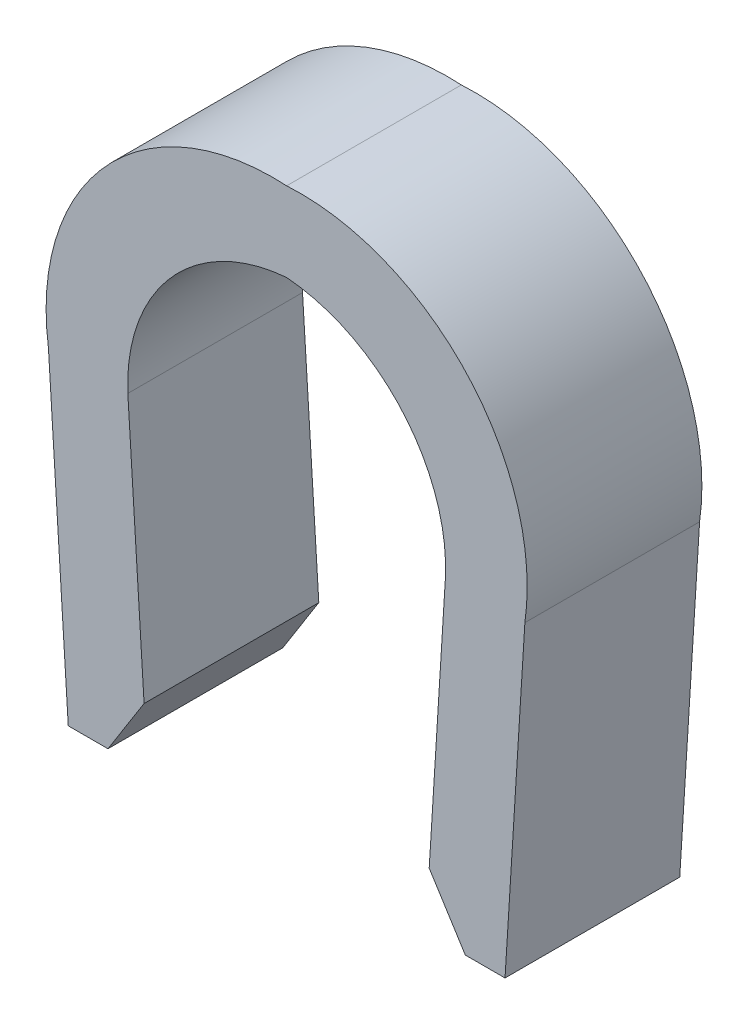
ISO-10303-21;
HEADER;
FILE_DESCRIPTION(('STEP AP214'),'2;1');
FILE_NAME('part.step','',(''),(''),'','','');
FILE_SCHEMA(('AUTOMOTIVE_DESIGN { 1 0 10303 214 1 1 1 1 }'));
ENDSEC;
DATA;
#1=APPLICATION_CONTEXT('core data for automotive mechanical design processes');
#2=APPLICATION_PROTOCOL_DEFINITION('international standard','automotive_design',2000,#1);
#3=PRODUCT_CONTEXT('',#1,'mechanical');
#4=PRODUCT('Part','Part','',(#3));
#5=PRODUCT_RELATED_PRODUCT_CATEGORY('part','',(#4));
#6=PRODUCT_DEFINITION_FORMATION('','',#4);
#7=PRODUCT_DEFINITION_CONTEXT('part definition',#1,'design');
#8=PRODUCT_DEFINITION('design','',#6,#7);
#9=PRODUCT_DEFINITION_SHAPE('','',#8);
#10=(LENGTH_UNIT() NAMED_UNIT(*) SI_UNIT(.MILLI.,.METRE.));
#11=(NAMED_UNIT(*) PLANE_ANGLE_UNIT() SI_UNIT($,.RADIAN.));
#12=(NAMED_UNIT(*) SI_UNIT($,.STERADIAN.) SOLID_ANGLE_UNIT());
#13=UNCERTAINTY_MEASURE_WITH_UNIT(LENGTH_MEASURE(1.E-05),#10,'distance_accuracy_value','');
#14=(GEOMETRIC_REPRESENTATION_CONTEXT(3) GLOBAL_UNCERTAINTY_ASSIGNED_CONTEXT((#13)) GLOBAL_UNIT_ASSIGNED_CONTEXT((#10,
#11,#12)) REPRESENTATION_CONTEXT('',''));
#15=CARTESIAN_POINT('',(0.,0.,0.));
#16=DIRECTION('',(0.,0.,1.));
#17=DIRECTION('',(1.,0.,0.));
#18=AXIS2_PLACEMENT_3D('',#15,#16,#17);
#19=CARTESIAN_POINT('',(4.,3.76931874325355,4.4));
#20=DIRECTION('',(0.998052578482889,-0.0623782861551805,0.));
#21=DIRECTION('',(0.0623782861551805,0.998052578482889,0.));
#22=AXIS2_PLACEMENT_3D('',#19,#20,#21);
#23=PLANE('',#22);
#24=DIRECTION('',(0.,0.,-1.));
#25=VECTOR('',#24,1.);
#26=CARTESIAN_POINT('',(3.59009666619429,-2.78913459763788,4.4));
#27=LINE('',#26,#25);
#28=CARTESIAN_POINT('',(3.59009666619429,-2.78913459763788,4.4));
#29=VERTEX_POINT('',#28);
#30=CARTESIAN_POINT('',(3.59009666619429,-2.78913459763788,0.));
#31=VERTEX_POINT('',#30);
#32=EDGE_CURVE('E48',#29,#31,#27,.T.);
#33=ORIENTED_EDGE('',*,*,#32,.F.);
#34=DIRECTION('',(-0.0623782861551805,-0.998052578482889,0.));
#35=VECTOR('',#34,1.);
#36=CARTESIAN_POINT('',(4.,3.76931874325355,4.4));
#37=LINE('',#36,#35);
#38=CARTESIAN_POINT('',(4.,3.76931874325355,4.4));
#39=VERTEX_POINT('',#38);
#40=EDGE_CURVE('E201',#39,#29,#37,.T.);
#41=ORIENTED_EDGE('',*,*,#40,.F.);
#42=DIRECTION('',(0.,0.,-1.));
#43=VECTOR('',#42,1.);
#44=CARTESIAN_POINT('',(4.,3.76931874325355,4.4));
#45=LINE('',#44,#43);
#46=CARTESIAN_POINT('',(4.,3.76931874325355,0.));
#47=VERTEX_POINT('',#46);
#48=EDGE_CURVE('E186',#39,#47,#45,.T.);
#49=ORIENTED_EDGE('',*,*,#48,.T.);
#50=DIRECTION('',(-0.0623782861551805,-0.998052578482889,0.));
#51=VECTOR('',#50,1.);
#52=CARTESIAN_POINT('',(4.,3.76931874325355,0.));
#53=LINE('',#52,#51);
#54=EDGE_CURVE('E153',#47,#31,#53,.T.);
#55=ORIENTED_EDGE('',*,*,#54,.T.);
#56=EDGE_LOOP('',(#33,#41,#49,#55));
#57=FACE_BOUND('',#56,.T.);
#58=ADVANCED_FACE('F33',(#57),#23,.F.);
#59=CARTESIAN_POINT('',(3.5,-4.23068125674645,4.4));
#60=DIRECTION('',(0.,1.,0.));
#61=DIRECTION('',(0.,0.,1.));
#62=AXIS2_PLACEMENT_3D('',#59,#60,#61);
#63=PLANE('',#62);
#64=DIRECTION('',(0.,0.,-1.));
#65=VECTOR('',#64,1.);
#66=CARTESIAN_POINT('',(4.5,-4.23068125674645,4.4));
#67=LINE('',#66,#65);
#68=CARTESIAN_POINT('',(4.5,-4.23068125674645,4.4));
#69=VERTEX_POINT('',#68);
#70=CARTESIAN_POINT('',(4.5,-4.23068125674645,0.));
#71=VERTEX_POINT('',#70);
#72=EDGE_CURVE('E136',#69,#71,#67,.T.);
#73=ORIENTED_EDGE('',*,*,#72,.T.);
#74=DIRECTION('',(1.,0.,0.));
#75=VECTOR('',#74,1.);
#76=CARTESIAN_POINT('',(3.5,-4.23068125674645,0.));
#77=LINE('',#76,#75);
#78=CARTESIAN_POINT('',(5.5,-4.23068125674645,0.));
#79=VERTEX_POINT('',#78);
#80=EDGE_CURVE('E156',#71,#79,#77,.T.);
#81=ORIENTED_EDGE('',*,*,#80,.T.);
#82=DIRECTION('',(0.,0.,-1.));
#83=VECTOR('',#82,1.);
#84=CARTESIAN_POINT('',(5.5,-4.23068125674645,4.4));
#85=LINE('',#84,#83);
#86=CARTESIAN_POINT('',(5.5,-4.23068125674645,4.4));
#87=VERTEX_POINT('',#86);
#88=EDGE_CURVE('E183',#87,#79,#85,.T.);
#89=ORIENTED_EDGE('',*,*,#88,.F.);
#90=DIRECTION('',(1.,0.,0.));
#91=VECTOR('',#90,1.);
#92=CARTESIAN_POINT('',(3.5,-4.23068125674645,4.4));
#93=LINE('',#92,#91);
#94=EDGE_CURVE('E214',#69,#87,#93,.T.);
#95=ORIENTED_EDGE('',*,*,#94,.F.);
#96=EDGE_LOOP('',(#73,#81,#89,#95));
#97=FACE_BOUND('',#96,.T.);
#98=ADVANCED_FACE('F236',(#97),#63,.F.);
#99=CARTESIAN_POINT('',(-3.5,-4.23068125674645,4.4));
#100=DIRECTION('',(0.,1.,0.));
#101=DIRECTION('',(0.,0.,1.));
#102=AXIS2_PLACEMENT_3D('',#99,#100,#101);
#103=PLANE('',#102);
#104=DIRECTION('',(0.,0.,-1.));
#105=VECTOR('',#104,1.);
#106=CARTESIAN_POINT('',(-4.5,-4.23068125674645,4.4));
#107=LINE('',#106,#105);
#108=CARTESIAN_POINT('',(-4.5,-4.23068125674645,4.4));
#109=VERTEX_POINT('',#108);
#110=CARTESIAN_POINT('',(-4.5,-4.23068125674645,0.));
#111=VERTEX_POINT('',#110);
#112=EDGE_CURVE('E56',#109,#111,#107,.T.);
#113=ORIENTED_EDGE('',*,*,#112,.F.);
#114=DIRECTION('',(1.,0.,0.));
#115=VECTOR('',#114,1.);
#116=CARTESIAN_POINT('',(-3.5,-4.23068125674645,4.4));
#117=LINE('',#116,#115);
#118=CARTESIAN_POINT('',(-5.5,-4.23068125674645,4.4));
#119=VERTEX_POINT('',#118);
#120=EDGE_CURVE('E135',#119,#109,#117,.T.);
#121=ORIENTED_EDGE('',*,*,#120,.F.);
#122=DIRECTION('',(0.,0.,-1.));
#123=VECTOR('',#122,1.);
#124=CARTESIAN_POINT('',(-5.5,-4.23068125674645,4.4));
#125=LINE('',#124,#123);
#126=CARTESIAN_POINT('',(-5.5,-4.23068125674645,0.));
#127=VERTEX_POINT('',#126);
#128=EDGE_CURVE('E143',#119,#127,#125,.T.);
#129=ORIENTED_EDGE('',*,*,#128,.T.);
#130=DIRECTION('',(1.,0.,0.));
#131=VECTOR('',#130,1.);
#132=CARTESIAN_POINT('',(-3.5,-4.23068125674645,0.));
#133=LINE('',#132,#131);
#134=EDGE_CURVE('E166',#127,#111,#133,.T.);
#135=ORIENTED_EDGE('',*,*,#134,.T.);
#136=EDGE_LOOP('',(#113,#121,#129,#135));
#137=FACE_BOUND('',#136,.T.);
#138=ADVANCED_FACE('F230',(#137),#103,.F.);
#139=CARTESIAN_POINT('',(-4.,3.76931874325355,4.4));
#140=DIRECTION('',(-0.998052578482889,-0.0623782861551805,0.));
#141=DIRECTION('',(0.0623782861551805,-0.998052578482889,0.));
#142=AXIS2_PLACEMENT_3D('',#139,#140,#141);
#143=PLANE('',#142);
#144=DIRECTION('',(0.,0.,-1.));
#145=VECTOR('',#144,1.);
#146=CARTESIAN_POINT('',(-3.59009666619429,-2.78913459763788,4.4));
#147=LINE('',#146,#145);
#148=CARTESIAN_POINT('',(-3.59009666619429,-2.78913459763788,4.4));
#149=VERTEX_POINT('',#148);
#150=CARTESIAN_POINT('',(-3.59009666619429,-2.78913459763788,0.));
#151=VERTEX_POINT('',#150);
#152=EDGE_CURVE('E119',#149,#151,#147,.T.);
#153=ORIENTED_EDGE('',*,*,#152,.T.);
#154=DIRECTION('',(-0.0623782861551805,0.998052578482889,0.));
#155=VECTOR('',#154,1.);
#156=CARTESIAN_POINT('',(-4.,3.76931874325355,0.));
#157=LINE('',#156,#155);
#158=CARTESIAN_POINT('',(-4.,3.76931874325355,0.));
#159=VERTEX_POINT('',#158);
#160=EDGE_CURVE('E169',#151,#159,#157,.T.);
#161=ORIENTED_EDGE('',*,*,#160,.T.);
#162=DIRECTION('',(0.,0.,-1.));
#163=VECTOR('',#162,1.);
#164=CARTESIAN_POINT('',(-4.,3.76931874325355,4.4));
#165=LINE('',#164,#163);
#166=CARTESIAN_POINT('',(-4.,3.76931874325355,4.4));
#167=VERTEX_POINT('',#166);
#168=EDGE_CURVE('E140',#167,#159,#165,.T.);
#169=ORIENTED_EDGE('',*,*,#168,.F.);
#170=DIRECTION('',(-0.0623782861551805,0.998052578482889,0.));
#171=VECTOR('',#170,1.);
#172=CARTESIAN_POINT('',(-4.,3.76931874325355,4.4));
#173=LINE('',#172,#171);
#174=EDGE_CURVE('E132',#149,#167,#173,.T.);
#175=ORIENTED_EDGE('',*,*,#174,.F.);
#176=EDGE_LOOP('',(#153,#161,#169,#175));
#177=FACE_BOUND('',#176,.T.);
#178=ADVANCED_FACE('F138',(#177),#143,.F.);
#179=CARTESIAN_POINT('',(0.352098437399392,3.95594353678218,4.4));
#180=DIRECTION('',(0.,0.,-1.));
#181=DIRECTION('',(-1.,0.,0.));
#182=AXIS2_PLACEMENT_3D('',#179,#180,#181);
#183=PLANE('',#182);
#184=DIRECTION('',(-0.533763512348094,-0.845633793604434,0.));
#185=VECTOR('',#184,1.);
#186=CARTESIAN_POINT('',(-4.5,-4.23068125674645,4.4));
#187=LINE('',#186,#185);
#188=EDGE_CURVE('E122',#149,#109,#187,.T.);
#189=ORIENTED_EDGE('',*,*,#188,.F.);
#190=ORIENTED_EDGE('',*,*,#174,.T.);
#191=CARTESIAN_POINT('',(0.352098437399392,3.95594353678218,4.4));
#192=DIRECTION('',(0.,0.,-1.));
#193=DIRECTION('',(-1.,0.,0.));
#194=AXIS2_PLACEMENT_3D('',#191,#192,#193);
#195=CIRCLE('',#194,4.35609798126418);
#196=CARTESIAN_POINT('',(0.,8.29778834201816,4.4));
#197=VERTEX_POINT('',#196);
#198=EDGE_CURVE('E170',#167,#197,#195,.T.);
#199=ORIENTED_EDGE('',*,*,#198,.T.);
#200=CARTESIAN_POINT('',(-0.352098437399392,3.95594353678218,4.4));
#201=DIRECTION('',(0.,0.,-1.));
#202=DIRECTION('',(1.,0.,0.));
#203=AXIS2_PLACEMENT_3D('',#200,#201,#202);
#204=CIRCLE('',#203,4.35609798126418);
#205=EDGE_CURVE('E204',#197,#39,#204,.T.);
#206=ORIENTED_EDGE('',*,*,#205,.T.);
#207=ORIENTED_EDGE('',*,*,#40,.T.);
#208=DIRECTION('',(-0.533763512348093,0.845633793604434,0.));
#209=VECTOR('',#208,1.);
#210=CARTESIAN_POINT('',(3.59009666619429,-2.78913459763788,4.4));
#211=LINE('',#210,#209);
#212=EDGE_CURVE('E233',#69,#29,#211,.T.);
#213=ORIENTED_EDGE('',*,*,#212,.F.);
#214=ORIENTED_EDGE('',*,*,#94,.T.);
#215=DIRECTION('',(0.0623782861551807,0.998052578482889,0.));
#216=VECTOR('',#215,1.);
#217=CARTESIAN_POINT('',(5.5,-4.23068125674645,4.4));
#218=LINE('',#217,#216);
#219=CARTESIAN_POINT('',(6.,3.76931874325355,4.4));
#220=VERTEX_POINT('',#219);
#221=EDGE_CURVE('E216',#87,#220,#218,.T.);
#222=ORIENTED_EDGE('',*,*,#221,.T.);
#223=CARTESIAN_POINT('',(0.331443417167046,4.58101252137912,4.4));
#224=DIRECTION('',(0.,0.,1.));
#225=DIRECTION('',(1.,0.,0.));
#226=AXIS2_PLACEMENT_3D('',#223,#224,#225);
#227=CIRCLE('',#226,5.72637586281468);
#228=CARTESIAN_POINT('',(0.,10.2977883420182,4.4));
#229=VERTEX_POINT('',#228);
#230=EDGE_CURVE('E218',#220,#229,#227,.T.);
#231=ORIENTED_EDGE('',*,*,#230,.T.);
#232=CARTESIAN_POINT('',(-0.331443417167046,4.58101252137912,4.4));
#233=DIRECTION('',(0.,0.,1.));
#234=DIRECTION('',(-1.,0.,0.));
#235=AXIS2_PLACEMENT_3D('',#232,#233,#234);
#236=CIRCLE('',#235,5.72637586281468);
#237=CARTESIAN_POINT('',(-6.,3.76931874325355,4.4));
#238=VERTEX_POINT('',#237);
#239=EDGE_CURVE('E220',#229,#238,#236,.T.);
#240=ORIENTED_EDGE('',*,*,#239,.T.);
#241=DIRECTION('',(0.0623782861551807,-0.998052578482889,0.));
#242=VECTOR('',#241,1.);
#243=CARTESIAN_POINT('',(-5.5,-4.23068125674645,4.4));
#244=LINE('',#243,#242);
#245=EDGE_CURVE('E145',#238,#119,#244,.T.);
#246=ORIENTED_EDGE('',*,*,#245,.T.);
#247=ORIENTED_EDGE('',*,*,#120,.T.);
#248=EDGE_LOOP('',(#189,#190,#199,#206,#207,#213,#214,#222,#231,#240,#246,#247));
#249=FACE_BOUND('',#248,.T.);
#250=ADVANCED_FACE('F130',(#249),#183,.F.);
#251=CARTESIAN_POINT('',(0.352098437399392,3.95594353678218,0.));
#252=DIRECTION('',(0.,0.,-1.));
#253=DIRECTION('',(-1.,0.,0.));
#254=AXIS2_PLACEMENT_3D('',#251,#252,#253);
#255=PLANE('',#254);
#256=ORIENTED_EDGE('',*,*,#160,.F.);
#257=DIRECTION('',(-0.533763512348094,-0.845633793604434,0.));
#258=VECTOR('',#257,1.);
#259=CARTESIAN_POINT('',(0.577564021681137,3.81362980347348,0.));
#260=LINE('',#259,#258);
#261=EDGE_CURVE('E11',#151,#111,#260,.T.);
#262=ORIENTED_EDGE('',*,*,#261,.T.);
#263=ORIENTED_EDGE('',*,*,#134,.F.);
#264=DIRECTION('',(0.0623782861551807,-0.998052578482889,0.));
#265=VECTOR('',#264,1.);
#266=CARTESIAN_POINT('',(-5.5,-4.23068125674645,0.));
#267=LINE('',#266,#265);
#268=CARTESIAN_POINT('',(-6.,3.76931874325355,0.));
#269=VERTEX_POINT('',#268);
#270=EDGE_CURVE('E164',#269,#127,#267,.T.);
#271=ORIENTED_EDGE('',*,*,#270,.F.);
#272=CARTESIAN_POINT('',(-0.331443417167046,4.58101252137912,0.));
#273=DIRECTION('',(0.,0.,1.));
#274=DIRECTION('',(-1.,0.,0.));
#275=AXIS2_PLACEMENT_3D('',#272,#273,#274);
#276=CIRCLE('',#275,5.72637586281468);
#277=CARTESIAN_POINT('',(0.,10.2977883420182,0.));
#278=VERTEX_POINT('',#277);
#279=EDGE_CURVE('E162',#278,#269,#276,.T.);
#280=ORIENTED_EDGE('',*,*,#279,.F.);
#281=CARTESIAN_POINT('',(0.331443417167046,4.58101252137912,0.));
#282=DIRECTION('',(0.,0.,1.));
#283=DIRECTION('',(1.,0.,0.));
#284=AXIS2_PLACEMENT_3D('',#281,#282,#283);
#285=CIRCLE('',#284,5.72637586281468);
#286=CARTESIAN_POINT('',(6.,3.76931874325355,0.));
#287=VERTEX_POINT('',#286);
#288=EDGE_CURVE('E160',#287,#278,#285,.T.);
#289=ORIENTED_EDGE('',*,*,#288,.F.);
#290=DIRECTION('',(0.0623782861551807,0.998052578482889,0.));
#291=VECTOR('',#290,1.);
#292=CARTESIAN_POINT('',(5.5,-4.23068125674645,0.));
#293=LINE('',#292,#291);
#294=EDGE_CURVE('E158',#79,#287,#293,.T.);
#295=ORIENTED_EDGE('',*,*,#294,.F.);
#296=ORIENTED_EDGE('',*,*,#80,.F.);
#297=DIRECTION('',(-0.533763512348093,0.845633793604434,0.));
#298=VECTOR('',#297,1.);
#299=CARTESIAN_POINT('',(-0.376935876436055,3.49577754185847,0.));
#300=LINE('',#299,#298);
#301=EDGE_CURVE('E41',#71,#31,#300,.T.);
#302=ORIENTED_EDGE('',*,*,#301,.T.);
#303=ORIENTED_EDGE('',*,*,#54,.F.);
#304=CARTESIAN_POINT('',(-0.352098437399392,3.95594353678218,0.));
#305=DIRECTION('',(0.,0.,-1.));
#306=DIRECTION('',(1.,0.,0.));
#307=AXIS2_PLACEMENT_3D('',#304,#305,#306);
#308=CIRCLE('',#307,4.35609798126418);
#309=CARTESIAN_POINT('',(0.,8.29778834201816,0.));
#310=VERTEX_POINT('',#309);
#311=EDGE_CURVE('E151',#310,#47,#308,.T.);
#312=ORIENTED_EDGE('',*,*,#311,.F.);
#313=CARTESIAN_POINT('',(0.352098437399392,3.95594353678218,0.));
#314=DIRECTION('',(0.,0.,-1.));
#315=DIRECTION('',(-1.,0.,0.));
#316=AXIS2_PLACEMENT_3D('',#313,#314,#315);
#317=CIRCLE('',#316,4.35609798126418);
#318=EDGE_CURVE('E126',#159,#310,#317,.T.);
#319=ORIENTED_EDGE('',*,*,#318,.F.);
#320=EDGE_LOOP('',(#256,#262,#263,#271,#280,#289,#295,#296,#302,#303,#312,#319));
#321=FACE_BOUND('',#320,.T.);
#322=ADVANCED_FACE('F194',(#321),#255,.T.);
#323=CARTESIAN_POINT('',(0.352098437399392,3.95594353678218,4.4));
#324=DIRECTION('',(0.,0.,-1.));
#325=DIRECTION('',(-1.,0.,0.));
#326=AXIS2_PLACEMENT_3D('',#323,#324,#325);
#327=CYLINDRICAL_SURFACE('',#326,4.35609798126418);
#328=ORIENTED_EDGE('',*,*,#318,.T.);
#329=DIRECTION('',(0.,0.,-1.));
#330=VECTOR('',#329,1.);
#331=CARTESIAN_POINT('',(0.,8.29778834201816,4.4));
#332=LINE('',#331,#330);
#333=EDGE_CURVE('E189',#197,#310,#332,.T.);
#334=ORIENTED_EDGE('',*,*,#333,.F.);
#335=ORIENTED_EDGE('',*,*,#198,.F.);
#336=ORIENTED_EDGE('',*,*,#168,.T.);
#337=EDGE_LOOP('',(#328,#334,#335,#336));
#338=FACE_BOUND('',#337,.T.);
#339=ADVANCED_FACE('F35',(#338),#327,.F.);
#340=CARTESIAN_POINT('',(-0.352098437399392,3.95594353678218,4.4));
#341=DIRECTION('',(0.,0.,-1.));
#342=DIRECTION('',(-1.,0.,0.));
#343=AXIS2_PLACEMENT_3D('',#340,#341,#342);
#344=CYLINDRICAL_SURFACE('',#343,4.35609798126418);
#345=ORIENTED_EDGE('',*,*,#311,.T.);
#346=ORIENTED_EDGE('',*,*,#48,.F.);
#347=ORIENTED_EDGE('',*,*,#205,.F.);
#348=ORIENTED_EDGE('',*,*,#333,.T.);
#349=EDGE_LOOP('',(#345,#346,#347,#348));
#350=FACE_BOUND('',#349,.T.);
#351=ADVANCED_FACE('F203',(#350),#344,.F.);
#352=CARTESIAN_POINT('',(5.5,-4.23068125674645,4.4));
#353=DIRECTION('',(-0.998052578482889,0.0623782861551807,0.));
#354=DIRECTION('',(-0.0623782861551807,-0.998052578482889,0.));
#355=AXIS2_PLACEMENT_3D('',#352,#353,#354);
#356=PLANE('',#355);
#357=ORIENTED_EDGE('',*,*,#294,.T.);
#358=DIRECTION('',(0.,0.,-1.));
#359=VECTOR('',#358,1.);
#360=CARTESIAN_POINT('',(6.,3.76931874325355,4.4));
#361=LINE('',#360,#359);
#362=EDGE_CURVE('E180',#220,#287,#361,.T.);
#363=ORIENTED_EDGE('',*,*,#362,.F.);
#364=ORIENTED_EDGE('',*,*,#221,.F.);
#365=ORIENTED_EDGE('',*,*,#88,.T.);
#366=EDGE_LOOP('',(#357,#363,#364,#365));
#367=FACE_BOUND('',#366,.T.);
#368=ADVANCED_FACE('F243',(#367),#356,.F.);
#369=CARTESIAN_POINT('',(0.331443417167046,4.58101252137912,4.4));
#370=DIRECTION('',(0.,0.,-1.));
#371=DIRECTION('',(-1.,0.,0.));
#372=AXIS2_PLACEMENT_3D('',#369,#370,#371);
#373=CYLINDRICAL_SURFACE('',#372,5.72637586281468);
#374=ORIENTED_EDGE('',*,*,#288,.T.);
#375=DIRECTION('',(0.,0.,-1.));
#376=VECTOR('',#375,1.);
#377=CARTESIAN_POINT('',(0.,10.2977883420182,4.4));
#378=LINE('',#377,#376);
#379=EDGE_CURVE('E177',#229,#278,#378,.T.);
#380=ORIENTED_EDGE('',*,*,#379,.F.);
#381=ORIENTED_EDGE('',*,*,#230,.F.);
#382=ORIENTED_EDGE('',*,*,#362,.T.);
#383=EDGE_LOOP('',(#374,#380,#381,#382));
#384=FACE_BOUND('',#383,.T.);
#385=ADVANCED_FACE('F248',(#384),#373,.T.);
#386=CARTESIAN_POINT('',(-0.331443417167046,4.58101252137912,4.4));
#387=DIRECTION('',(0.,0.,-1.));
#388=DIRECTION('',(-1.,0.,0.));
#389=AXIS2_PLACEMENT_3D('',#386,#387,#388);
#390=CYLINDRICAL_SURFACE('',#389,5.72637586281468);
#391=ORIENTED_EDGE('',*,*,#279,.T.);
#392=DIRECTION('',(0.,0.,-1.));
#393=VECTOR('',#392,1.);
#394=CARTESIAN_POINT('',(-6.,3.76931874325355,4.4));
#395=LINE('',#394,#393);
#396=EDGE_CURVE('E174',#238,#269,#395,.T.);
#397=ORIENTED_EDGE('',*,*,#396,.F.);
#398=ORIENTED_EDGE('',*,*,#239,.F.);
#399=ORIENTED_EDGE('',*,*,#379,.T.);
#400=EDGE_LOOP('',(#391,#397,#398,#399));
#401=FACE_BOUND('',#400,.T.);
#402=ADVANCED_FACE('F251',(#401),#390,.T.);
#403=CARTESIAN_POINT('',(-5.5,-4.23068125674645,4.4));
#404=DIRECTION('',(0.998052578482889,0.0623782861551807,0.));
#405=DIRECTION('',(-0.0623782861551807,0.998052578482889,0.));
#406=AXIS2_PLACEMENT_3D('',#403,#404,#405);
#407=PLANE('',#406);
#408=ORIENTED_EDGE('',*,*,#270,.T.);
#409=ORIENTED_EDGE('',*,*,#128,.F.);
#410=ORIENTED_EDGE('',*,*,#245,.F.);
#411=ORIENTED_EDGE('',*,*,#396,.T.);
#412=EDGE_LOOP('',(#408,#409,#410,#411));
#413=FACE_BOUND('',#412,.T.);
#414=ADVANCED_FACE('F226',(#413),#407,.F.);
#415=CARTESIAN_POINT('',(3.59009666619429,-2.78913459763788,4.4));
#416=DIRECTION('',(-0.845633793604434,-0.533763512348093,0.));
#417=DIRECTION('',(0.533763512348093,-0.845633793604434,0.));
#418=AXIS2_PLACEMENT_3D('',#415,#416,#417);
#419=PLANE('',#418);
#420=ORIENTED_EDGE('',*,*,#72,.F.);
#421=ORIENTED_EDGE('',*,*,#212,.T.);
#422=ORIENTED_EDGE('',*,*,#32,.T.);
#423=ORIENTED_EDGE('',*,*,#301,.F.);
#424=EDGE_LOOP('',(#420,#421,#422,#423));
#425=FACE_BOUND('',#424,.T.);
#426=ADVANCED_FACE('F239',(#425),#419,.T.);
#427=CARTESIAN_POINT('',(-4.5,-4.23068125674645,4.4));
#428=DIRECTION('',(0.845633793604434,-0.533763512348094,0.));
#429=DIRECTION('',(0.533763512348094,0.845633793604434,0.));
#430=AXIS2_PLACEMENT_3D('',#427,#428,#429);
#431=PLANE('',#430);
#432=ORIENTED_EDGE('',*,*,#152,.F.);
#433=ORIENTED_EDGE('',*,*,#188,.T.);
#434=ORIENTED_EDGE('',*,*,#112,.T.);
#435=ORIENTED_EDGE('',*,*,#261,.F.);
#436=EDGE_LOOP('',(#432,#433,#434,#435));
#437=FACE_BOUND('',#436,.T.);
#438=ADVANCED_FACE('F121',(#437),#431,.T.);
#439=CLOSED_SHELL('',(#58,#98,#138,#178,#250,#322,#339,#351,#368,#385,#402,#414,#426,#438));
#440=MANIFOLD_SOLID_BREP('B2',#439);
#441=ADVANCED_BREP_SHAPE_REPRESENTATION('',(#18,#440),#14);
#442=SHAPE_DEFINITION_REPRESENTATION(#9,#441);
ENDSEC;
END-ISO-10303-21;
